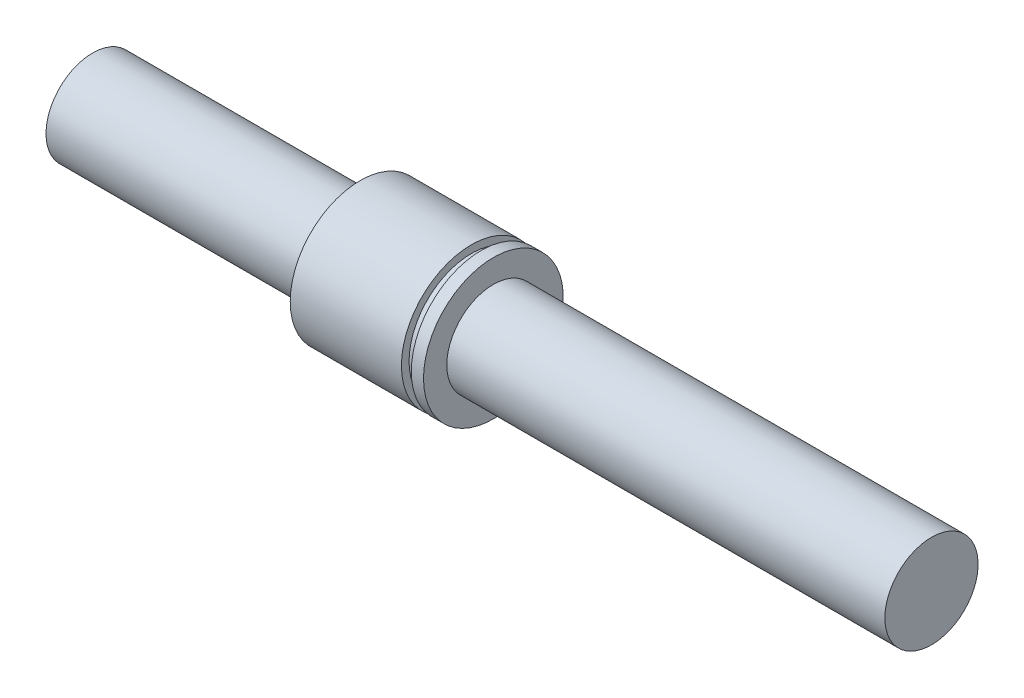
ISO-10303-21;
HEADER;
FILE_DESCRIPTION(('STEP AP214'),'2;1');
FILE_NAME('part.step','',(''),(''),'','','');
FILE_SCHEMA(('AUTOMOTIVE_DESIGN { 1 0 10303 214 1 1 1 1 }'));
ENDSEC;
DATA;
#1=APPLICATION_CONTEXT('core data for automotive mechanical design processes');
#2=APPLICATION_PROTOCOL_DEFINITION('international standard','automotive_design',2000,#1);
#3=PRODUCT_CONTEXT('',#1,'mechanical');
#4=PRODUCT('Part','Part','',(#3));
#5=PRODUCT_RELATED_PRODUCT_CATEGORY('part','',(#4));
#6=PRODUCT_DEFINITION_FORMATION('','',#4);
#7=PRODUCT_DEFINITION_CONTEXT('part definition',#1,'design');
#8=PRODUCT_DEFINITION('design','',#6,#7);
#9=PRODUCT_DEFINITION_SHAPE('','',#8);
#10=(LENGTH_UNIT() NAMED_UNIT(*) SI_UNIT(.MILLI.,.METRE.));
#11=(NAMED_UNIT(*) PLANE_ANGLE_UNIT() SI_UNIT($,.RADIAN.));
#12=(NAMED_UNIT(*) SI_UNIT($,.STERADIAN.) SOLID_ANGLE_UNIT());
#13=UNCERTAINTY_MEASURE_WITH_UNIT(LENGTH_MEASURE(1.E-05),#10,'distance_accuracy_value','');
#14=(GEOMETRIC_REPRESENTATION_CONTEXT(3) GLOBAL_UNCERTAINTY_ASSIGNED_CONTEXT((#13)) GLOBAL_UNIT_ASSIGNED_CONTEXT((#10,
#11,#12)) REPRESENTATION_CONTEXT('',''));
#15=CARTESIAN_POINT('',(0.,0.,0.));
#16=DIRECTION('',(0.,0.,1.));
#17=DIRECTION('',(1.,0.,0.));
#18=AXIS2_PLACEMENT_3D('',#15,#16,#17);
#19=CARTESIAN_POINT('',(-63.1865982961721,0.656434369656945,0.));
#20=DIRECTION('',(-1.,0.,0.));
#21=DIRECTION('',(0.,0.,1.));
#22=AXIS2_PLACEMENT_3D('',#19,#20,#21);
#23=CYLINDRICAL_SURFACE('',#22,5.00000000000001);
#24=CARTESIAN_POINT('',(-20.1865982961722,0.656434369656945,0.));
#25=DIRECTION('',(-1.,0.,0.));
#26=DIRECTION('',(0.,0.,1.));
#27=AXIS2_PLACEMENT_3D('',#24,#25,#26);
#28=CIRCLE('',#27,5.00000000000001);
#29=CARTESIAN_POINT('',(-20.1865982961722,0.656434369656945,5.00000000000001));
#30=VERTEX_POINT('',#29);
#31=EDGE_CURVE('E10',#30,#30,#28,.T.);
#32=ORIENTED_EDGE('',*,*,#31,.F.);
#33=EDGE_LOOP('',(#32));
#34=FACE_BOUND('',#33,.T.);
#35=CARTESIAN_POINT('',(26.8134017038279,0.656434369656945,0.));
#36=DIRECTION('',(-1.,0.,0.));
#37=DIRECTION('',(0.,0.,1.));
#38=AXIS2_PLACEMENT_3D('',#35,#36,#37);
#39=CIRCLE('',#38,5.);
#40=CARTESIAN_POINT('',(26.8134017038279,0.656434369656945,5.));
#41=VERTEX_POINT('',#40);
#42=EDGE_CURVE('E69',#41,#41,#39,.T.);
#43=ORIENTED_EDGE('',*,*,#42,.T.);
#44=EDGE_LOOP('',(#43));
#45=FACE_BOUND('',#44,.T.);
#46=ADVANCED_FACE('F35',(#34,#45),#23,.T.);
#47=CARTESIAN_POINT('',(-20.1865982961722,8.15643436965696,0.));
#48=DIRECTION('',(-1.,0.,0.));
#49=DIRECTION('',(0.,0.,1.));
#50=AXIS2_PLACEMENT_3D('',#47,#48,#49);
#51=PLANE('',#50);
#52=CARTESIAN_POINT('',(-20.1865982961722,0.656434369656945,0.));
#53=DIRECTION('',(-1.,0.,0.));
#54=DIRECTION('',(0.,0.,1.));
#55=AXIS2_PLACEMENT_3D('',#52,#53,#54);
#56=CIRCLE('',#55,7.50000000000001);
#57=CARTESIAN_POINT('',(-20.1865982961722,0.656434369656945,7.50000000000001));
#58=VERTEX_POINT('',#57);
#59=EDGE_CURVE('E41',#58,#58,#56,.T.);
#60=ORIENTED_EDGE('',*,*,#59,.F.);
#61=EDGE_LOOP('',(#60));
#62=FACE_BOUND('',#61,.T.);
#63=ORIENTED_EDGE('',*,*,#31,.T.);
#64=EDGE_LOOP('',(#63));
#65=FACE_BOUND('',#64,.T.);
#66=ADVANCED_FACE('F85',(#62,#65),#51,.F.);
#67=CARTESIAN_POINT('',(-63.1865982961721,0.656434369656945,0.));
#68=DIRECTION('',(-1.,0.,0.));
#69=DIRECTION('',(0.,0.,1.));
#70=AXIS2_PLACEMENT_3D('',#67,#68,#69);
#71=CYLINDRICAL_SURFACE('',#70,7.50000000000001);
#72=CARTESIAN_POINT('',(-21.4970978259383,0.656434369656945,0.));
#73=DIRECTION('',(-1.,0.,0.));
#74=DIRECTION('',(0.,0.,1.));
#75=AXIS2_PLACEMENT_3D('',#72,#73,#74);
#76=CIRCLE('',#75,7.50000000000001);
#77=CARTESIAN_POINT('',(-21.4970978259383,0.656434369656945,7.50000000000001));
#78=VERTEX_POINT('',#77);
#79=EDGE_CURVE('E45',#78,#78,#76,.T.);
#80=ORIENTED_EDGE('',*,*,#79,.F.);
#81=EDGE_LOOP('',(#80));
#82=FACE_BOUND('',#81,.T.);
#83=ORIENTED_EDGE('',*,*,#59,.T.);
#84=EDGE_LOOP('',(#83));
#85=FACE_BOUND('',#84,.T.);
#86=ADVANCED_FACE('F90',(#82,#85),#71,.T.);
#87=CARTESIAN_POINT('',(-21.4970978259383,8.15643436965696,0.));
#88=DIRECTION('',(1.,0.,0.));
#89=DIRECTION('',(0.,0.,-1.));
#90=AXIS2_PLACEMENT_3D('',#87,#88,#89);
#91=PLANE('',#90);
#92=CARTESIAN_POINT('',(-21.4970978259383,0.656434369656945,0.));
#93=DIRECTION('',(-1.,0.,0.));
#94=DIRECTION('',(0.,0.,1.));
#95=AXIS2_PLACEMENT_3D('',#92,#93,#94);
#96=CIRCLE('',#95,6.68162424646641);
#97=CARTESIAN_POINT('',(-21.4970978259383,0.656434369656945,6.68162424646641));
#98=VERTEX_POINT('',#97);
#99=EDGE_CURVE('E49',#98,#98,#96,.T.);
#100=ORIENTED_EDGE('',*,*,#99,.F.);
#101=EDGE_LOOP('',(#100));
#102=FACE_BOUND('',#101,.T.);
#103=ORIENTED_EDGE('',*,*,#79,.T.);
#104=EDGE_LOOP('',(#103));
#105=FACE_BOUND('',#104,.T.);
#106=ADVANCED_FACE('F95',(#102,#105),#91,.F.);
#107=CARTESIAN_POINT('',(-63.1865982961721,0.656434369656945,0.));
#108=DIRECTION('',(-1.,0.,0.));
#109=DIRECTION('',(0.,0.,1.));
#110=AXIS2_PLACEMENT_3D('',#107,#108,#109);
#111=CYLINDRICAL_SURFACE('',#110,6.68162424646641);
#112=CARTESIAN_POINT('',(-22.5546012819048,0.656434369656945,0.));
#113=DIRECTION('',(-1.,0.,0.));
#114=DIRECTION('',(0.,0.,1.));
#115=AXIS2_PLACEMENT_3D('',#112,#113,#114);
#116=CIRCLE('',#115,6.68162424646641);
#117=CARTESIAN_POINT('',(-22.5546012819048,0.656434369656945,6.68162424646641));
#118=VERTEX_POINT('',#117);
#119=EDGE_CURVE('E54',#118,#118,#116,.T.);
#120=ORIENTED_EDGE('',*,*,#119,.F.);
#121=EDGE_LOOP('',(#120));
#122=FACE_BOUND('',#121,.T.);
#123=ORIENTED_EDGE('',*,*,#99,.T.);
#124=EDGE_LOOP('',(#123));
#125=FACE_BOUND('',#124,.T.);
#126=ADVANCED_FACE('F101',(#122,#125),#111,.T.);
#127=CARTESIAN_POINT('',(-22.5546012819048,8.15643436965696,0.));
#128=DIRECTION('',(-1.,0.,0.));
#129=DIRECTION('',(0.,0.,1.));
#130=AXIS2_PLACEMENT_3D('',#127,#128,#129);
#131=PLANE('',#130);
#132=CARTESIAN_POINT('',(-22.5546012819048,0.656434369656945,0.));
#133=DIRECTION('',(-1.,0.,0.));
#134=DIRECTION('',(0.,0.,1.));
#135=AXIS2_PLACEMENT_3D('',#132,#133,#134);
#136=CIRCLE('',#135,7.50000000000001);
#137=CARTESIAN_POINT('',(-22.5546012819048,0.656434369656945,7.50000000000001));
#138=VERTEX_POINT('',#137);
#139=EDGE_CURVE('E57',#138,#138,#136,.T.);
#140=ORIENTED_EDGE('',*,*,#139,.F.);
#141=EDGE_LOOP('',(#140));
#142=FACE_BOUND('',#141,.T.);
#143=ORIENTED_EDGE('',*,*,#119,.T.);
#144=EDGE_LOOP('',(#143));
#145=FACE_BOUND('',#144,.T.);
#146=ADVANCED_FACE('F105',(#142,#145),#131,.F.);
#147=CARTESIAN_POINT('',(-63.1865982961721,0.656434369656945,0.));
#148=DIRECTION('',(-1.,0.,0.));
#149=DIRECTION('',(0.,0.,1.));
#150=AXIS2_PLACEMENT_3D('',#147,#148,#149);
#151=CYLINDRICAL_SURFACE('',#150,7.50000000000001);
#152=CARTESIAN_POINT('',(-34.4844160006179,0.656434369656945,0.));
#153=DIRECTION('',(-1.,0.,0.));
#154=DIRECTION('',(0.,0.,1.));
#155=AXIS2_PLACEMENT_3D('',#152,#153,#154);
#156=CIRCLE('',#155,7.50000000000001);
#157=CARTESIAN_POINT('',(-34.4844160006179,0.656434369656945,7.50000000000001));
#158=VERTEX_POINT('',#157);
#159=EDGE_CURVE('E60',#158,#158,#156,.T.);
#160=ORIENTED_EDGE('',*,*,#159,.F.);
#161=EDGE_LOOP('',(#160));
#162=FACE_BOUND('',#161,.T.);
#163=ORIENTED_EDGE('',*,*,#139,.T.);
#164=EDGE_LOOP('',(#163));
#165=FACE_BOUND('',#164,.T.);
#166=ADVANCED_FACE('F109',(#162,#165),#151,.T.);
#167=CARTESIAN_POINT('',(-34.4844160006179,8.15643436965696,0.));
#168=DIRECTION('',(1.,0.,0.));
#169=DIRECTION('',(0.,0.,-1.));
#170=AXIS2_PLACEMENT_3D('',#167,#168,#169);
#171=PLANE('',#170);
#172=CARTESIAN_POINT('',(-34.4844160006179,0.656434369656945,0.));
#173=DIRECTION('',(-1.,0.,0.));
#174=DIRECTION('',(0.,0.,1.));
#175=AXIS2_PLACEMENT_3D('',#172,#173,#174);
#176=CIRCLE('',#175,5.00000000000001);
#177=CARTESIAN_POINT('',(-34.4844160006179,0.656434369656945,5.00000000000001));
#178=VERTEX_POINT('',#177);
#179=EDGE_CURVE('E63',#178,#178,#176,.T.);
#180=ORIENTED_EDGE('',*,*,#179,.F.);
#181=EDGE_LOOP('',(#180));
#182=FACE_BOUND('',#181,.T.);
#183=ORIENTED_EDGE('',*,*,#159,.T.);
#184=EDGE_LOOP('',(#183));
#185=FACE_BOUND('',#184,.T.);
#186=ADVANCED_FACE('F113',(#182,#185),#171,.F.);
#187=CARTESIAN_POINT('',(-63.1865982961721,0.656434369656945,0.));
#188=DIRECTION('',(-1.,0.,0.));
#189=DIRECTION('',(0.,0.,1.));
#190=AXIS2_PLACEMENT_3D('',#187,#188,#189);
#191=CYLINDRICAL_SURFACE('',#190,5.);
#192=CARTESIAN_POINT('',(-63.1865982961721,0.656434369656945,0.));
#193=DIRECTION('',(-1.,0.,0.));
#194=DIRECTION('',(0.,0.,1.));
#195=AXIS2_PLACEMENT_3D('',#192,#193,#194);
#196=CIRCLE('',#195,4.99999999999999);
#197=CARTESIAN_POINT('',(-63.1865982961721,0.656434369656945,4.99999999999999));
#198=VERTEX_POINT('',#197);
#199=EDGE_CURVE('E66',#198,#198,#196,.T.);
#200=ORIENTED_EDGE('',*,*,#199,.F.);
#201=EDGE_LOOP('',(#200));
#202=FACE_BOUND('',#201,.T.);
#203=ORIENTED_EDGE('',*,*,#179,.T.);
#204=EDGE_LOOP('',(#203));
#205=FACE_BOUND('',#204,.T.);
#206=ADVANCED_FACE('F81',(#202,#205),#191,.T.);
#207=CARTESIAN_POINT('',(-63.1865982961721,5.65643436965694,0.));
#208=DIRECTION('',(1.,0.,0.));
#209=DIRECTION('',(0.,0.,-1.));
#210=AXIS2_PLACEMENT_3D('',#207,#208,#209);
#211=PLANE('',#210);
#212=ORIENTED_EDGE('',*,*,#199,.T.);
#213=EDGE_LOOP('',(#212));
#214=FACE_BOUND('',#213,.T.);
#215=ADVANCED_FACE('F76',(#214),#211,.F.);
#216=CARTESIAN_POINT('',(26.8134017038279,0.656434369656945,0.));
#217=DIRECTION('',(-1.,0.,0.));
#218=DIRECTION('',(0.,0.,1.));
#219=AXIS2_PLACEMENT_3D('',#216,#217,#218);
#220=PLANE('',#219);
#221=ORIENTED_EDGE('',*,*,#42,.F.);
#222=EDGE_LOOP('',(#221));
#223=FACE_BOUND('',#222,.T.);
#224=ADVANCED_FACE('F74',(#223),#220,.F.);
#225=CLOSED_SHELL('',(#46,#66,#86,#106,#126,#146,#166,#186,#206,#215,#224));
#226=MANIFOLD_SOLID_BREP('B2',#225);
#227=ADVANCED_BREP_SHAPE_REPRESENTATION('',(#18,#226),#14);
#228=SHAPE_DEFINITION_REPRESENTATION(#9,#227);
ENDSEC;
END-ISO-10303-21;
